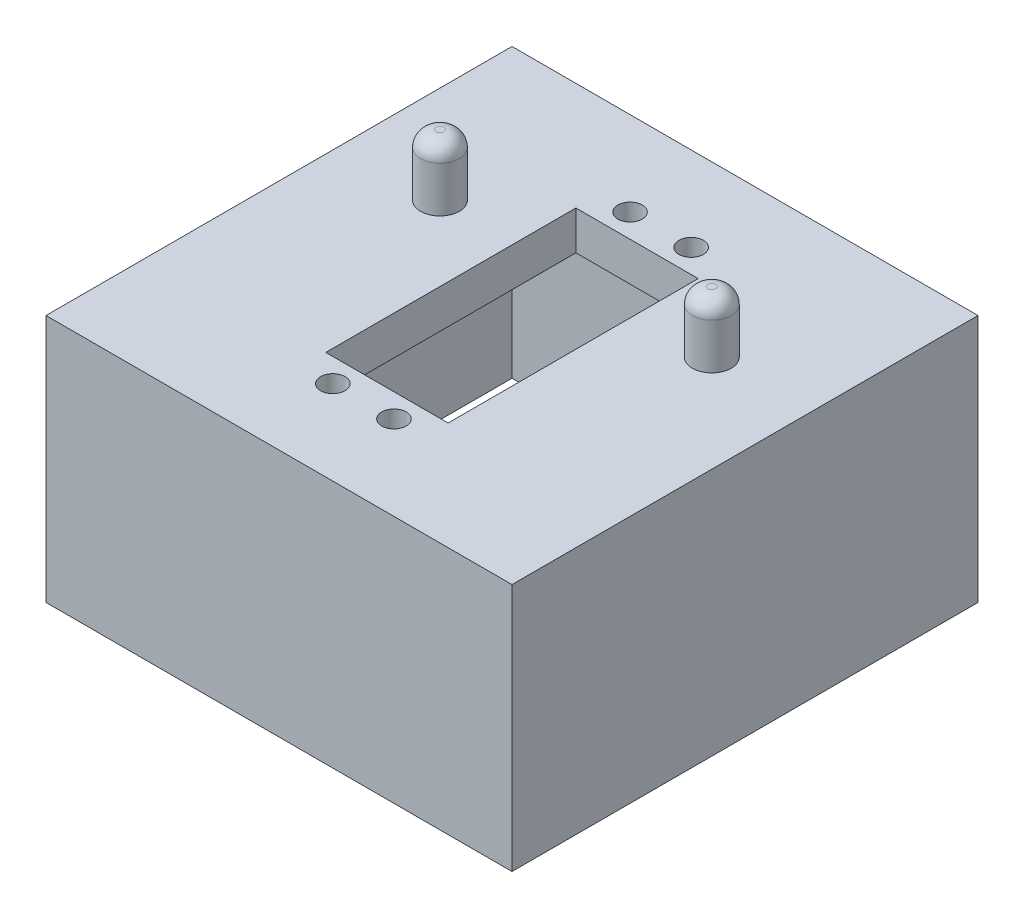
ISO-10303-21;
HEADER;
FILE_DESCRIPTION(('STEP AP214'),'2;1');
FILE_NAME('part.step','',(''),(''),'','','');
FILE_SCHEMA(('AUTOMOTIVE_DESIGN { 1 0 10303 214 1 1 1 1 }'));
ENDSEC;
DATA;
#1=APPLICATION_CONTEXT('core data for automotive mechanical design processes');
#2=APPLICATION_PROTOCOL_DEFINITION('international standard','automotive_design',2000,#1);
#3=PRODUCT_CONTEXT('',#1,'mechanical');
#4=PRODUCT('Part','Part','',(#3));
#5=PRODUCT_RELATED_PRODUCT_CATEGORY('part','',(#4));
#6=PRODUCT_DEFINITION_FORMATION('','',#4);
#7=PRODUCT_DEFINITION_CONTEXT('part definition',#1,'design');
#8=PRODUCT_DEFINITION('design','',#6,#7);
#9=PRODUCT_DEFINITION_SHAPE('','',#8);
#10=(LENGTH_UNIT() NAMED_UNIT(*) SI_UNIT(.MILLI.,.METRE.));
#11=(NAMED_UNIT(*) PLANE_ANGLE_UNIT() SI_UNIT($,.RADIAN.));
#12=(NAMED_UNIT(*) SI_UNIT($,.STERADIAN.) SOLID_ANGLE_UNIT());
#13=UNCERTAINTY_MEASURE_WITH_UNIT(LENGTH_MEASURE(1.E-05),#10,'distance_accuracy_value','');
#14=(GEOMETRIC_REPRESENTATION_CONTEXT(3) GLOBAL_UNCERTAINTY_ASSIGNED_CONTEXT((#13)) GLOBAL_UNIT_ASSIGNED_CONTEXT((#10,
#11,#12)) REPRESENTATION_CONTEXT('',''));
#15=CARTESIAN_POINT('',(0.,0.,0.));
#16=DIRECTION('',(0.,0.,1.));
#17=DIRECTION('',(1.,0.,0.));
#18=AXIS2_PLACEMENT_3D('',#15,#16,#17);
#19=CARTESIAN_POINT('',(0.,40.64,76.2));
#20=DIRECTION('',(0.,1.,0.));
#21=DIRECTION('',(0.,0.,1.));
#22=AXIS2_PLACEMENT_3D('',#19,#20,#21);
#23=PLANE('',#22);
#24=CARTESIAN_POINT('',(60.325,40.64,27.65044));
#25=DIRECTION('',(0.,1.,0.));
#26=DIRECTION('',(0.,0.,1.));
#27=AXIS2_PLACEMENT_3D('',#24,#25,#26);
#28=CIRCLE('',#27,3.17500000000001);
#29=CARTESIAN_POINT('',(60.325,40.64,30.82544));
#30=VERTEX_POINT('',#29);
#31=EDGE_CURVE('E587',#30,#30,#28,.T.);
#32=ORIENTED_EDGE('',*,*,#31,.F.);
#33=EDGE_LOOP('',(#32));
#34=FACE_BOUND('',#33,.T.);
#35=CARTESIAN_POINT('',(15.875,40.64,27.65044));
#36=DIRECTION('',(0.,1.,0.));
#37=DIRECTION('',(0.,0.,1.));
#38=AXIS2_PLACEMENT_3D('',#35,#36,#37);
#39=CIRCLE('',#38,3.175);
#40=CARTESIAN_POINT('',(15.875,40.64,30.82544));
#41=VERTEX_POINT('',#40);
#42=EDGE_CURVE('E590',#41,#41,#39,.T.);
#43=ORIENTED_EDGE('',*,*,#42,.F.);
#44=EDGE_LOOP('',(#43));
#45=FACE_BOUND('',#44,.T.);
#46=CARTESIAN_POINT('',(43.1,40.64,13.8));
#47=DIRECTION('',(0.,1.,0.));
#48=DIRECTION('',(0.,0.,1.));
#49=AXIS2_PLACEMENT_3D('',#46,#47,#48);
#50=CIRCLE('',#49,2.);
#51=CARTESIAN_POINT('',(43.1,40.64,15.8));
#52=VERTEX_POINT('',#51);
#53=EDGE_CURVE('E593',#52,#52,#50,.T.);
#54=ORIENTED_EDGE('',*,*,#53,.F.);
#55=EDGE_LOOP('',(#54));
#56=FACE_BOUND('',#55,.T.);
#57=CARTESIAN_POINT('',(33.1,40.64,13.8));
#58=DIRECTION('',(0.,1.,0.));
#59=DIRECTION('',(0.,0.,1.));
#60=AXIS2_PLACEMENT_3D('',#57,#58,#59);
#61=CIRCLE('',#60,2.00000000000002);
#62=CARTESIAN_POINT('',(33.1,40.64,15.8));
#63=VERTEX_POINT('',#62);
#64=EDGE_CURVE('E601',#63,#63,#61,.T.);
#65=ORIENTED_EDGE('',*,*,#64,.F.);
#66=EDGE_LOOP('',(#65));
#67=FACE_BOUND('',#66,.T.);
#68=CARTESIAN_POINT('',(33.1,40.64,62.4));
#69=DIRECTION('',(0.,1.,0.));
#70=DIRECTION('',(0.,0.,1.));
#71=AXIS2_PLACEMENT_3D('',#68,#69,#70);
#72=CIRCLE('',#71,2.00000000000001);
#73=CARTESIAN_POINT('',(33.1,40.64,64.4));
#74=VERTEX_POINT('',#73);
#75=EDGE_CURVE('E598',#74,#74,#72,.T.);
#76=ORIENTED_EDGE('',*,*,#75,.F.);
#77=EDGE_LOOP('',(#76));
#78=FACE_BOUND('',#77,.T.);
#79=CARTESIAN_POINT('',(43.1,40.64,62.4));
#80=DIRECTION('',(0.,1.,0.));
#81=DIRECTION('',(0.,0.,1.));
#82=AXIS2_PLACEMENT_3D('',#79,#80,#81);
#83=CIRCLE('',#82,2.);
#84=CARTESIAN_POINT('',(43.1,40.64,64.4));
#85=VERTEX_POINT('',#84);
#86=EDGE_CURVE('E594',#85,#85,#83,.T.);
#87=ORIENTED_EDGE('',*,*,#86,.F.);
#88=EDGE_LOOP('',(#87));
#89=FACE_BOUND('',#88,.T.);
#90=DIRECTION('',(1.,0.,0.));
#91=VECTOR('',#90,1.);
#92=CARTESIAN_POINT('',(0.,40.64,0.));
#93=LINE('',#92,#91);
#94=CARTESIAN_POINT('',(0.,40.64,0.));
#95=VERTEX_POINT('',#94);
#96=CARTESIAN_POINT('',(76.2,40.64,0.));
#97=VERTEX_POINT('',#96);
#98=EDGE_CURVE('E234',#95,#97,#93,.T.);
#99=ORIENTED_EDGE('',*,*,#98,.F.);
#100=DIRECTION('',(0.,0.,-1.));
#101=VECTOR('',#100,1.);
#102=CARTESIAN_POINT('',(0.,40.64,76.2));
#103=LINE('',#102,#101);
#104=CARTESIAN_POINT('',(0.,40.64,76.2));
#105=VERTEX_POINT('',#104);
#106=EDGE_CURVE('E240',#105,#95,#103,.T.);
#107=ORIENTED_EDGE('',*,*,#106,.F.);
#108=DIRECTION('',(1.,0.,0.));
#109=VECTOR('',#108,1.);
#110=CARTESIAN_POINT('',(0.,40.64,76.2));
#111=LINE('',#110,#109);
#112=CARTESIAN_POINT('',(76.2,40.64,76.2));
#113=VERTEX_POINT('',#112);
#114=EDGE_CURVE('E222',#105,#113,#111,.T.);
#115=ORIENTED_EDGE('',*,*,#114,.T.);
#116=DIRECTION('',(0.,0.,-1.));
#117=VECTOR('',#116,1.);
#118=CARTESIAN_POINT('',(76.2,40.64,76.2));
#119=LINE('',#118,#117);
#120=EDGE_CURVE('E242',#113,#97,#119,.T.);
#121=ORIENTED_EDGE('',*,*,#120,.T.);
#122=EDGE_LOOP('',(#99,#107,#115,#121));
#123=FACE_BOUND('',#122,.T.);
#124=DIRECTION('',(1.,0.,0.));
#125=VECTOR('',#124,1.);
#126=CARTESIAN_POINT('',(0.,40.64,58.55));
#127=LINE('',#126,#125);
#128=CARTESIAN_POINT('',(28.1,40.64,58.55));
#129=VERTEX_POINT('',#128);
#130=CARTESIAN_POINT('',(48.1,40.64,58.55));
#131=VERTEX_POINT('',#130);
#132=EDGE_CURVE('E597',#129,#131,#127,.T.);
#133=ORIENTED_EDGE('',*,*,#132,.F.);
#134=DIRECTION('',(0.,0.,-1.));
#135=VECTOR('',#134,1.);
#136=CARTESIAN_POINT('',(28.1,40.64,0.));
#137=LINE('',#136,#135);
#138=CARTESIAN_POINT('',(28.1,40.64,17.65));
#139=VERTEX_POINT('',#138);
#140=EDGE_CURVE('E88',#129,#139,#137,.T.);
#141=ORIENTED_EDGE('',*,*,#140,.T.);
#142=DIRECTION('',(1.,0.,0.));
#143=VECTOR('',#142,1.);
#144=CARTESIAN_POINT('',(0.,40.64,17.65));
#145=LINE('',#144,#143);
#146=CARTESIAN_POINT('',(48.1,40.64,17.65));
#147=VERTEX_POINT('',#146);
#148=EDGE_CURVE('E611',#139,#147,#145,.T.);
#149=ORIENTED_EDGE('',*,*,#148,.T.);
#150=DIRECTION('',(0.,0.,-1.));
#151=VECTOR('',#150,1.);
#152=CARTESIAN_POINT('',(48.1,40.64,0.));
#153=LINE('',#152,#151);
#154=EDGE_CURVE('E608',#131,#147,#153,.T.);
#155=ORIENTED_EDGE('',*,*,#154,.F.);
#156=EDGE_LOOP('',(#133,#141,#149,#155));
#157=FACE_BOUND('',#156,.T.);
#158=ADVANCED_FACE('F65',(#34,#45,#56,#67,#78,#89,#123,#157),#23,.T.);
#159=CARTESIAN_POINT('',(0.,34.29,76.2));
#160=DIRECTION('',(0.,1.,0.));
#161=DIRECTION('',(0.,0.,1.));
#162=AXIS2_PLACEMENT_3D('',#159,#160,#161);
#163=PLANE('',#162);
#164=CARTESIAN_POINT('',(43.1,34.29,13.8));
#165=DIRECTION('',(0.,1.,0.));
#166=DIRECTION('',(0.,0.,1.));
#167=AXIS2_PLACEMENT_3D('',#164,#165,#166);
#168=CIRCLE('',#167,2.);
#169=CARTESIAN_POINT('',(43.1,34.29,15.8));
#170=VERTEX_POINT('',#169);
#171=EDGE_CURVE('E211',#170,#170,#168,.T.);
#172=ORIENTED_EDGE('',*,*,#171,.T.);
#173=EDGE_LOOP('',(#172));
#174=FACE_BOUND('',#173,.T.);
#175=CARTESIAN_POINT('',(33.1,34.29,13.8));
#176=DIRECTION('',(0.,1.,0.));
#177=DIRECTION('',(0.,0.,1.));
#178=AXIS2_PLACEMENT_3D('',#175,#176,#177);
#179=CIRCLE('',#178,2.00000000000002);
#180=CARTESIAN_POINT('',(33.1,34.29,15.8));
#181=VERTEX_POINT('',#180);
#182=EDGE_CURVE('E265',#181,#181,#179,.T.);
#183=ORIENTED_EDGE('',*,*,#182,.T.);
#184=EDGE_LOOP('',(#183));
#185=FACE_BOUND('',#184,.T.);
#186=CARTESIAN_POINT('',(33.1,34.29,62.4));
#187=DIRECTION('',(0.,1.,0.));
#188=DIRECTION('',(0.,0.,1.));
#189=AXIS2_PLACEMENT_3D('',#186,#187,#188);
#190=CIRCLE('',#189,2.00000000000001);
#191=CARTESIAN_POINT('',(33.1,34.29,64.4));
#192=VERTEX_POINT('',#191);
#193=EDGE_CURVE('E261',#192,#192,#190,.T.);
#194=ORIENTED_EDGE('',*,*,#193,.T.);
#195=EDGE_LOOP('',(#194));
#196=FACE_BOUND('',#195,.T.);
#197=CARTESIAN_POINT('',(43.1,34.29,62.4));
#198=DIRECTION('',(0.,1.,0.));
#199=DIRECTION('',(0.,0.,1.));
#200=AXIS2_PLACEMENT_3D('',#197,#198,#199);
#201=CIRCLE('',#200,2.);
#202=CARTESIAN_POINT('',(43.1,34.29,64.4));
#203=VERTEX_POINT('',#202);
#204=EDGE_CURVE('E258',#203,#203,#201,.T.);
#205=ORIENTED_EDGE('',*,*,#204,.T.);
#206=EDGE_LOOP('',(#205));
#207=FACE_BOUND('',#206,.T.);
#208=DIRECTION('',(1.,0.,0.));
#209=VECTOR('',#208,1.);
#210=CARTESIAN_POINT('',(0.,34.29,6.34999999999999));
#211=LINE('',#210,#209);
#212=CARTESIAN_POINT('',(6.35,34.29,6.35));
#213=VERTEX_POINT('',#212);
#214=CARTESIAN_POINT('',(69.85,34.29,6.35));
#215=VERTEX_POINT('',#214);
#216=EDGE_CURVE('E209',#213,#215,#211,.T.);
#217=ORIENTED_EDGE('',*,*,#216,.T.);
#218=DIRECTION('',(0.,0.,-1.));
#219=VECTOR('',#218,1.);
#220=CARTESIAN_POINT('',(69.85,34.29,76.2));
#221=LINE('',#220,#219);
#222=CARTESIAN_POINT('',(69.85,34.29,69.85));
#223=VERTEX_POINT('',#222);
#224=EDGE_CURVE('E622',#223,#215,#221,.T.);
#225=ORIENTED_EDGE('',*,*,#224,.F.);
#226=DIRECTION('',(1.,0.,0.));
#227=VECTOR('',#226,1.);
#228=CARTESIAN_POINT('',(0.,34.29,69.85));
#229=LINE('',#228,#227);
#230=CARTESIAN_POINT('',(6.35,34.29,69.85));
#231=VERTEX_POINT('',#230);
#232=EDGE_CURVE('E628',#231,#223,#229,.T.);
#233=ORIENTED_EDGE('',*,*,#232,.F.);
#234=DIRECTION('',(0.,0.,-1.));
#235=VECTOR('',#234,1.);
#236=CARTESIAN_POINT('',(6.35,34.29,76.2));
#237=LINE('',#236,#235);
#238=EDGE_CURVE('E625',#231,#213,#237,.T.);
#239=ORIENTED_EDGE('',*,*,#238,.T.);
#240=EDGE_LOOP('',(#217,#225,#233,#239));
#241=FACE_BOUND('',#240,.T.);
#242=DIRECTION('',(0.,0.,-1.));
#243=VECTOR('',#242,1.);
#244=CARTESIAN_POINT('',(28.1,34.29,76.2));
#245=LINE('',#244,#243);
#246=CARTESIAN_POINT('',(28.1,34.29,58.55));
#247=VERTEX_POINT('',#246);
#248=CARTESIAN_POINT('',(28.1,34.29,17.65));
#249=VERTEX_POINT('',#248);
#250=EDGE_CURVE('E255',#247,#249,#245,.T.);
#251=ORIENTED_EDGE('',*,*,#250,.F.);
#252=DIRECTION('',(1.,0.,0.));
#253=VECTOR('',#252,1.);
#254=CARTESIAN_POINT('',(0.,34.29,58.55));
#255=LINE('',#254,#253);
#256=CARTESIAN_POINT('',(48.1,34.29,58.55));
#257=VERTEX_POINT('',#256);
#258=EDGE_CURVE('E247',#247,#257,#255,.T.);
#259=ORIENTED_EDGE('',*,*,#258,.T.);
#260=DIRECTION('',(0.,0.,-1.));
#261=VECTOR('',#260,1.);
#262=CARTESIAN_POINT('',(48.1,34.29,76.2));
#263=LINE('',#262,#261);
#264=CARTESIAN_POINT('',(48.1,34.29,17.65));
#265=VERTEX_POINT('',#264);
#266=EDGE_CURVE('E250',#257,#265,#263,.T.);
#267=ORIENTED_EDGE('',*,*,#266,.T.);
#268=DIRECTION('',(1.,0.,0.));
#269=VECTOR('',#268,1.);
#270=CARTESIAN_POINT('',(0.,34.29,17.65));
#271=LINE('',#270,#269);
#272=EDGE_CURVE('E253',#249,#265,#271,.T.);
#273=ORIENTED_EDGE('',*,*,#272,.F.);
#274=EDGE_LOOP('',(#251,#259,#267,#273));
#275=FACE_BOUND('',#274,.T.);
#276=ADVANCED_FACE('F292',(#174,#185,#196,#207,#241,#275),#163,.F.);
#277=CARTESIAN_POINT('',(0.,0.,76.2));
#278=DIRECTION('',(0.,1.,0.));
#279=DIRECTION('',(0.,0.,1.));
#280=AXIS2_PLACEMENT_3D('',#277,#278,#279);
#281=PLANE('',#280);
#282=DIRECTION('',(1.,0.,0.));
#283=VECTOR('',#282,1.);
#284=CARTESIAN_POINT('',(0.,0.,0.));
#285=LINE('',#284,#283);
#286=CARTESIAN_POINT('',(0.,0.,0.));
#287=VERTEX_POINT('',#286);
#288=CARTESIAN_POINT('',(31.75,0.,0.));
#289=VERTEX_POINT('',#288);
#290=EDGE_CURVE('E197',#287,#289,#285,.T.);
#291=ORIENTED_EDGE('',*,*,#290,.T.);
#292=DIRECTION('',(0.,0.,-1.));
#293=VECTOR('',#292,1.);
#294=CARTESIAN_POINT('',(31.75,0.,76.201));
#295=LINE('',#294,#293);
#296=CARTESIAN_POINT('',(31.75,0.,6.34999999999999));
#297=VERTEX_POINT('',#296);
#298=EDGE_CURVE('E183',#297,#289,#295,.T.);
#299=ORIENTED_EDGE('',*,*,#298,.F.);
#300=DIRECTION('',(1.,0.,0.));
#301=VECTOR('',#300,1.);
#302=CARTESIAN_POINT('',(0.,0.,6.34999999999999));
#303=LINE('',#302,#301);
#304=CARTESIAN_POINT('',(6.35,0.,6.35));
#305=VERTEX_POINT('',#304);
#306=EDGE_CURVE('E195',#305,#297,#303,.T.);
#307=ORIENTED_EDGE('',*,*,#306,.F.);
#308=DIRECTION('',(0.,0.,-1.));
#309=VECTOR('',#308,1.);
#310=CARTESIAN_POINT('',(6.35,0.,76.2));
#311=LINE('',#310,#309);
#312=CARTESIAN_POINT('',(6.35,0.,69.85));
#313=VERTEX_POINT('',#312);
#314=EDGE_CURVE('E214',#313,#305,#311,.T.);
#315=ORIENTED_EDGE('',*,*,#314,.F.);
#316=DIRECTION('',(1.,0.,0.));
#317=VECTOR('',#316,1.);
#318=CARTESIAN_POINT('',(0.,0.,69.85));
#319=LINE('',#318,#317);
#320=CARTESIAN_POINT('',(69.85,0.,69.85));
#321=VERTEX_POINT('',#320);
#322=EDGE_CURVE('E629',#313,#321,#319,.T.);
#323=ORIENTED_EDGE('',*,*,#322,.T.);
#324=DIRECTION('',(0.,0.,-1.));
#325=VECTOR('',#324,1.);
#326=CARTESIAN_POINT('',(69.85,0.,76.2));
#327=LINE('',#326,#325);
#328=CARTESIAN_POINT('',(69.85,0.,6.35));
#329=VERTEX_POINT('',#328);
#330=EDGE_CURVE('E624',#321,#329,#327,.T.);
#331=ORIENTED_EDGE('',*,*,#330,.T.);
#332=CARTESIAN_POINT('',(44.45,0.,6.34999999999999));
#333=VERTEX_POINT('',#332);
#334=EDGE_CURVE('E206',#333,#329,#303,.T.);
#335=ORIENTED_EDGE('',*,*,#334,.F.);
#336=DIRECTION('',(0.,0.,-1.));
#337=VECTOR('',#336,1.);
#338=CARTESIAN_POINT('',(44.45,0.,76.201));
#339=LINE('',#338,#337);
#340=CARTESIAN_POINT('',(44.45,0.,0.));
#341=VERTEX_POINT('',#340);
#342=EDGE_CURVE('E80',#333,#341,#339,.T.);
#343=ORIENTED_EDGE('',*,*,#342,.T.);
#344=CARTESIAN_POINT('',(76.2,0.,0.));
#345=VERTEX_POINT('',#344);
#346=EDGE_CURVE('E231',#341,#345,#285,.T.);
#347=ORIENTED_EDGE('',*,*,#346,.T.);
#348=DIRECTION('',(0.,0.,-1.));
#349=VECTOR('',#348,1.);
#350=CARTESIAN_POINT('',(76.2,0.,76.2));
#351=LINE('',#350,#349);
#352=CARTESIAN_POINT('',(76.2,0.,76.2));
#353=VERTEX_POINT('',#352);
#354=EDGE_CURVE('E244',#353,#345,#351,.T.);
#355=ORIENTED_EDGE('',*,*,#354,.F.);
#356=DIRECTION('',(1.,0.,0.));
#357=VECTOR('',#356,1.);
#358=CARTESIAN_POINT('',(0.,0.,76.2));
#359=LINE('',#358,#357);
#360=CARTESIAN_POINT('',(0.,0.,76.2));
#361=VERTEX_POINT('',#360);
#362=EDGE_CURVE('E216',#361,#353,#359,.T.);
#363=ORIENTED_EDGE('',*,*,#362,.F.);
#364=DIRECTION('',(0.,0.,-1.));
#365=VECTOR('',#364,1.);
#366=CARTESIAN_POINT('',(0.,0.,76.2));
#367=LINE('',#366,#365);
#368=EDGE_CURVE('E228',#361,#287,#367,.T.);
#369=ORIENTED_EDGE('',*,*,#368,.T.);
#370=EDGE_LOOP('',(#291,#299,#307,#315,#323,#331,#335,#343,#347,#355,#363,#369));
#371=FACE_BOUND('',#370,.T.);
#372=ADVANCED_FACE('F193',(#371),#281,.F.);
#373=CARTESIAN_POINT('',(76.2,0.,76.2));
#374=DIRECTION('',(-1.,0.,0.));
#375=DIRECTION('',(0.,0.,1.));
#376=AXIS2_PLACEMENT_3D('',#373,#374,#375);
#377=PLANE('',#376);
#378=DIRECTION('',(0.,1.,0.));
#379=VECTOR('',#378,1.);
#380=CARTESIAN_POINT('',(76.2,0.,0.));
#381=LINE('',#380,#379);
#382=EDGE_CURVE('E230',#345,#97,#381,.T.);
#383=ORIENTED_EDGE('',*,*,#382,.T.);
#384=ORIENTED_EDGE('',*,*,#120,.F.);
#385=DIRECTION('',(0.,1.,0.));
#386=VECTOR('',#385,1.);
#387=CARTESIAN_POINT('',(76.2,0.,76.2));
#388=LINE('',#387,#386);
#389=EDGE_CURVE('E219',#353,#113,#388,.T.);
#390=ORIENTED_EDGE('',*,*,#389,.F.);
#391=ORIENTED_EDGE('',*,*,#354,.T.);
#392=EDGE_LOOP('',(#383,#384,#390,#391));
#393=FACE_BOUND('',#392,.T.);
#394=ADVANCED_FACE('F308',(#393),#377,.F.);
#395=CARTESIAN_POINT('',(0.,0.,76.2));
#396=DIRECTION('',(-1.,0.,0.));
#397=DIRECTION('',(0.,0.,1.));
#398=AXIS2_PLACEMENT_3D('',#395,#396,#397);
#399=PLANE('',#398);
#400=DIRECTION('',(0.,1.,0.));
#401=VECTOR('',#400,1.);
#402=CARTESIAN_POINT('',(0.,0.,0.));
#403=LINE('',#402,#401);
#404=EDGE_CURVE('E220',#287,#95,#403,.T.);
#405=ORIENTED_EDGE('',*,*,#404,.F.);
#406=ORIENTED_EDGE('',*,*,#368,.F.);
#407=DIRECTION('',(0.,1.,0.));
#408=VECTOR('',#407,1.);
#409=CARTESIAN_POINT('',(0.,0.,76.2));
#410=LINE('',#409,#408);
#411=EDGE_CURVE('E225',#361,#105,#410,.T.);
#412=ORIENTED_EDGE('',*,*,#411,.T.);
#413=ORIENTED_EDGE('',*,*,#106,.T.);
#414=EDGE_LOOP('',(#405,#406,#412,#413));
#415=FACE_BOUND('',#414,.T.);
#416=ADVANCED_FACE('F306',(#415),#399,.T.);
#417=CARTESIAN_POINT('',(0.,0.,76.2));
#418=DIRECTION('',(0.,0.,1.));
#419=DIRECTION('',(1.,0.,0.));
#420=AXIS2_PLACEMENT_3D('',#417,#418,#419);
#421=PLANE('',#420);
#422=ORIENTED_EDGE('',*,*,#362,.T.);
#423=ORIENTED_EDGE('',*,*,#389,.T.);
#424=ORIENTED_EDGE('',*,*,#114,.F.);
#425=ORIENTED_EDGE('',*,*,#411,.F.);
#426=EDGE_LOOP('',(#422,#423,#424,#425));
#427=FACE_BOUND('',#426,.T.);
#428=ADVANCED_FACE('F324',(#427),#421,.T.);
#429=CARTESIAN_POINT('',(0.,0.,0.));
#430=DIRECTION('',(0.,0.,1.));
#431=DIRECTION('',(1.,0.,0.));
#432=AXIS2_PLACEMENT_3D('',#429,#430,#431);
#433=PLANE('',#432);
#434=DIRECTION('',(1.,0.,0.));
#435=VECTOR('',#434,1.);
#436=CARTESIAN_POINT('',(44.45,6.35,0.));
#437=LINE('',#436,#435);
#438=CARTESIAN_POINT('',(31.75,6.35,0.));
#439=VERTEX_POINT('',#438);
#440=CARTESIAN_POINT('',(44.45,6.35,0.));
#441=VERTEX_POINT('',#440);
#442=EDGE_CURVE('E198',#439,#441,#437,.T.);
#443=ORIENTED_EDGE('',*,*,#442,.F.);
#444=DIRECTION('',(0.,1.,0.));
#445=VECTOR('',#444,1.);
#446=CARTESIAN_POINT('',(31.75,0.,0.));
#447=LINE('',#446,#445);
#448=EDGE_CURVE('E571',#289,#439,#447,.T.);
#449=ORIENTED_EDGE('',*,*,#448,.F.);
#450=ORIENTED_EDGE('',*,*,#290,.F.);
#451=ORIENTED_EDGE('',*,*,#404,.T.);
#452=ORIENTED_EDGE('',*,*,#98,.T.);
#453=ORIENTED_EDGE('',*,*,#382,.F.);
#454=ORIENTED_EDGE('',*,*,#346,.F.);
#455=DIRECTION('',(0.,-1.,0.));
#456=VECTOR('',#455,1.);
#457=CARTESIAN_POINT('',(44.45,0.,0.));
#458=LINE('',#457,#456);
#459=EDGE_CURVE('E574',#441,#341,#458,.T.);
#460=ORIENTED_EDGE('',*,*,#459,.F.);
#461=EDGE_LOOP('',(#443,#449,#450,#451,#452,#453,#454,#460));
#462=FACE_BOUND('',#461,.T.);
#463=ADVANCED_FACE('F319',(#462),#433,.F.);
#464=CARTESIAN_POINT('',(69.85,0.,76.2));
#465=DIRECTION('',(-1.,0.,0.));
#466=DIRECTION('',(0.,0.,1.));
#467=AXIS2_PLACEMENT_3D('',#464,#465,#466);
#468=PLANE('',#467);
#469=DIRECTION('',(0.,1.,0.));
#470=VECTOR('',#469,1.);
#471=CARTESIAN_POINT('',(69.85,0.,6.34999999999999));
#472=LINE('',#471,#470);
#473=EDGE_CURVE('E205',#329,#215,#472,.T.);
#474=ORIENTED_EDGE('',*,*,#473,.F.);
#475=ORIENTED_EDGE('',*,*,#330,.F.);
#476=DIRECTION('',(0.,1.,0.));
#477=VECTOR('',#476,1.);
#478=CARTESIAN_POINT('',(69.85,0.,69.85));
#479=LINE('',#478,#477);
#480=EDGE_CURVE('E626',#321,#223,#479,.T.);
#481=ORIENTED_EDGE('',*,*,#480,.T.);
#482=ORIENTED_EDGE('',*,*,#224,.T.);
#483=EDGE_LOOP('',(#474,#475,#481,#482));
#484=FACE_BOUND('',#483,.T.);
#485=ADVANCED_FACE('F323',(#484),#468,.T.);
#486=CARTESIAN_POINT('',(6.35,0.,76.2));
#487=DIRECTION('',(-1.,0.,0.));
#488=DIRECTION('',(0.,0.,1.));
#489=AXIS2_PLACEMENT_3D('',#486,#487,#488);
#490=PLANE('',#489);
#491=DIRECTION('',(0.,1.,0.));
#492=VECTOR('',#491,1.);
#493=CARTESIAN_POINT('',(6.35,0.,6.34999999999999));
#494=LINE('',#493,#492);
#495=EDGE_CURVE('E204',#305,#213,#494,.T.);
#496=ORIENTED_EDGE('',*,*,#495,.T.);
#497=ORIENTED_EDGE('',*,*,#238,.F.);
#498=DIRECTION('',(0.,1.,0.));
#499=VECTOR('',#498,1.);
#500=CARTESIAN_POINT('',(6.35,0.,69.85));
#501=LINE('',#500,#499);
#502=EDGE_CURVE('E635',#313,#231,#501,.T.);
#503=ORIENTED_EDGE('',*,*,#502,.F.);
#504=ORIENTED_EDGE('',*,*,#314,.T.);
#505=EDGE_LOOP('',(#496,#497,#503,#504));
#506=FACE_BOUND('',#505,.T.);
#507=ADVANCED_FACE('F500',(#506),#490,.F.);
#508=CARTESIAN_POINT('',(0.,0.,69.85));
#509=DIRECTION('',(0.,0.,1.));
#510=DIRECTION('',(1.,0.,0.));
#511=AXIS2_PLACEMENT_3D('',#508,#509,#510);
#512=PLANE('',#511);
#513=ORIENTED_EDGE('',*,*,#322,.F.);
#514=ORIENTED_EDGE('',*,*,#502,.T.);
#515=ORIENTED_EDGE('',*,*,#232,.T.);
#516=ORIENTED_EDGE('',*,*,#480,.F.);
#517=EDGE_LOOP('',(#513,#514,#515,#516));
#518=FACE_BOUND('',#517,.T.);
#519=ADVANCED_FACE('F333',(#518),#512,.F.);
#520=CARTESIAN_POINT('',(0.,0.,6.35));
#521=DIRECTION('',(0.,0.,1.));
#522=DIRECTION('',(1.,0.,0.));
#523=AXIS2_PLACEMENT_3D('',#520,#521,#522);
#524=PLANE('',#523);
#525=DIRECTION('',(0.,1.,0.));
#526=VECTOR('',#525,1.);
#527=CARTESIAN_POINT('',(31.75,0.,6.34999999999999));
#528=LINE('',#527,#526);
#529=CARTESIAN_POINT('',(31.75,6.35,6.34999999999999));
#530=VERTEX_POINT('',#529);
#531=EDGE_CURVE('E179',#297,#530,#528,.T.);
#532=ORIENTED_EDGE('',*,*,#531,.T.);
#533=DIRECTION('',(1.,0.,0.));
#534=VECTOR('',#533,1.);
#535=CARTESIAN_POINT('',(44.45,6.35,6.34999999999999));
#536=LINE('',#535,#534);
#537=CARTESIAN_POINT('',(44.45,6.35,6.34999999999999));
#538=VERTEX_POINT('',#537);
#539=EDGE_CURVE('E582',#530,#538,#536,.T.);
#540=ORIENTED_EDGE('',*,*,#539,.T.);
#541=DIRECTION('',(0.,-1.,0.));
#542=VECTOR('',#541,1.);
#543=CARTESIAN_POINT('',(44.45,0.,6.34999999999999));
#544=LINE('',#543,#542);
#545=EDGE_CURVE('E579',#538,#333,#544,.T.);
#546=ORIENTED_EDGE('',*,*,#545,.T.);
#547=ORIENTED_EDGE('',*,*,#334,.T.);
#548=ORIENTED_EDGE('',*,*,#473,.T.);
#549=ORIENTED_EDGE('',*,*,#216,.F.);
#550=ORIENTED_EDGE('',*,*,#495,.F.);
#551=ORIENTED_EDGE('',*,*,#306,.T.);
#552=EDGE_LOOP('',(#532,#540,#546,#547,#548,#549,#550,#551));
#553=FACE_BOUND('',#552,.T.);
#554=ADVANCED_FACE('F201',(#553),#524,.T.);
#555=CARTESIAN_POINT('',(28.1,0.,0.));
#556=DIRECTION('',(1.,0.,0.));
#557=DIRECTION('',(0.,0.,-1.));
#558=AXIS2_PLACEMENT_3D('',#555,#556,#557);
#559=PLANE('',#558);
#560=ORIENTED_EDGE('',*,*,#250,.T.);
#561=DIRECTION('',(0.,1.,0.));
#562=VECTOR('',#561,1.);
#563=CARTESIAN_POINT('',(28.1,0.,17.65));
#564=LINE('',#563,#562);
#565=EDGE_CURVE('E617',#249,#139,#564,.T.);
#566=ORIENTED_EDGE('',*,*,#565,.T.);
#567=ORIENTED_EDGE('',*,*,#140,.F.);
#568=DIRECTION('',(0.,1.,0.));
#569=VECTOR('',#568,1.);
#570=CARTESIAN_POINT('',(28.1,0.,58.55));
#571=LINE('',#570,#569);
#572=EDGE_CURVE('E262',#247,#129,#571,.T.);
#573=ORIENTED_EDGE('',*,*,#572,.F.);
#574=EDGE_LOOP('',(#560,#566,#567,#573));
#575=FACE_BOUND('',#574,.T.);
#576=ADVANCED_FACE('F332',(#575),#559,.T.);
#577=CARTESIAN_POINT('',(0.,0.,17.65));
#578=DIRECTION('',(0.,0.,1.));
#579=DIRECTION('',(1.,0.,0.));
#580=AXIS2_PLACEMENT_3D('',#577,#578,#579);
#581=PLANE('',#580);
#582=ORIENTED_EDGE('',*,*,#272,.T.);
#583=DIRECTION('',(0.,1.,0.));
#584=VECTOR('',#583,1.);
#585=CARTESIAN_POINT('',(48.1,0.,17.65));
#586=LINE('',#585,#584);
#587=EDGE_CURVE('E619',#265,#147,#586,.T.);
#588=ORIENTED_EDGE('',*,*,#587,.T.);
#589=ORIENTED_EDGE('',*,*,#148,.F.);
#590=ORIENTED_EDGE('',*,*,#565,.F.);
#591=EDGE_LOOP('',(#582,#588,#589,#590));
#592=FACE_BOUND('',#591,.T.);
#593=ADVANCED_FACE('F457',(#592),#581,.T.);
#594=CARTESIAN_POINT('',(48.1,0.,0.));
#595=DIRECTION('',(1.,0.,0.));
#596=DIRECTION('',(0.,0.,-1.));
#597=AXIS2_PLACEMENT_3D('',#594,#595,#596);
#598=PLANE('',#597);
#599=DIRECTION('',(0.,1.,0.));
#600=VECTOR('',#599,1.);
#601=CARTESIAN_POINT('',(48.1,0.,58.55));
#602=LINE('',#601,#600);
#603=EDGE_CURVE('E615',#257,#131,#602,.T.);
#604=ORIENTED_EDGE('',*,*,#603,.T.);
#605=ORIENTED_EDGE('',*,*,#154,.T.);
#606=ORIENTED_EDGE('',*,*,#587,.F.);
#607=ORIENTED_EDGE('',*,*,#266,.F.);
#608=EDGE_LOOP('',(#604,#605,#606,#607));
#609=FACE_BOUND('',#608,.T.);
#610=ADVANCED_FACE('F447',(#609),#598,.F.);
#611=CARTESIAN_POINT('',(0.,0.,58.55));
#612=DIRECTION('',(0.,0.,1.));
#613=DIRECTION('',(1.,0.,0.));
#614=AXIS2_PLACEMENT_3D('',#611,#612,#613);
#615=PLANE('',#614);
#616=ORIENTED_EDGE('',*,*,#572,.T.);
#617=ORIENTED_EDGE('',*,*,#132,.T.);
#618=ORIENTED_EDGE('',*,*,#603,.F.);
#619=ORIENTED_EDGE('',*,*,#258,.F.);
#620=EDGE_LOOP('',(#616,#617,#618,#619));
#621=FACE_BOUND('',#620,.T.);
#622=ADVANCED_FACE('F437',(#621),#615,.F.);
#623=CARTESIAN_POINT('',(43.1,0.,62.4));
#624=DIRECTION('',(0.,1.,0.));
#625=DIRECTION('',(0.,0.,1.));
#626=AXIS2_PLACEMENT_3D('',#623,#624,#625);
#627=CYLINDRICAL_SURFACE('',#626,2.);
#628=ORIENTED_EDGE('',*,*,#86,.T.);
#629=EDGE_LOOP('',(#628));
#630=FACE_BOUND('',#629,.T.);
#631=ORIENTED_EDGE('',*,*,#204,.F.);
#632=EDGE_LOOP('',(#631));
#633=FACE_BOUND('',#632,.T.);
#634=ADVANCED_FACE('F428',(#630,#633),#627,.F.);
#635=CARTESIAN_POINT('',(33.1,0.,62.4));
#636=DIRECTION('',(0.,1.,0.));
#637=DIRECTION('',(0.,0.,1.));
#638=AXIS2_PLACEMENT_3D('',#635,#636,#637);
#639=CYLINDRICAL_SURFACE('',#638,2.00000000000001);
#640=ORIENTED_EDGE('',*,*,#75,.T.);
#641=EDGE_LOOP('',(#640));
#642=FACE_BOUND('',#641,.T.);
#643=ORIENTED_EDGE('',*,*,#193,.F.);
#644=EDGE_LOOP('',(#643));
#645=FACE_BOUND('',#644,.T.);
#646=ADVANCED_FACE('F419',(#642,#645),#639,.F.);
#647=CARTESIAN_POINT('',(33.1,0.,13.8));
#648=DIRECTION('',(0.,1.,0.));
#649=DIRECTION('',(0.,0.,1.));
#650=AXIS2_PLACEMENT_3D('',#647,#648,#649);
#651=CYLINDRICAL_SURFACE('',#650,2.00000000000002);
#652=ORIENTED_EDGE('',*,*,#64,.T.);
#653=EDGE_LOOP('',(#652));
#654=FACE_BOUND('',#653,.T.);
#655=ORIENTED_EDGE('',*,*,#182,.F.);
#656=EDGE_LOOP('',(#655));
#657=FACE_BOUND('',#656,.T.);
#658=ADVANCED_FACE('F410',(#654,#657),#651,.F.);
#659=CARTESIAN_POINT('',(43.1,0.,13.8));
#660=DIRECTION('',(0.,1.,0.));
#661=DIRECTION('',(0.,0.,1.));
#662=AXIS2_PLACEMENT_3D('',#659,#660,#661);
#663=CYLINDRICAL_SURFACE('',#662,2.);
#664=ORIENTED_EDGE('',*,*,#53,.T.);
#665=EDGE_LOOP('',(#664));
#666=FACE_BOUND('',#665,.T.);
#667=ORIENTED_EDGE('',*,*,#171,.F.);
#668=EDGE_LOOP('',(#667));
#669=FACE_BOUND('',#668,.T.);
#670=ADVANCED_FACE('F402',(#666,#669),#663,.F.);
#671=CARTESIAN_POINT('',(15.875,50.64,27.65044));
#672=DIRECTION('',(0.,-1.,0.));
#673=DIRECTION('',(0.,0.,-1.));
#674=AXIS2_PLACEMENT_3D('',#671,#672,#673);
#675=CYLINDRICAL_SURFACE('',#674,3.175);
#676=CARTESIAN_POINT('',(15.875,48.1,27.65044));
#677=DIRECTION('',(0.,1.,0.));
#678=DIRECTION('',(0.,0.,1.));
#679=AXIS2_PLACEMENT_3D('',#676,#677,#678);
#680=CIRCLE('',#679,3.175);
#681=CARTESIAN_POINT('',(15.875,48.1,30.82544));
#682=VERTEX_POINT('',#681);
#683=EDGE_CURVE('E272',#682,#682,#680,.F.);
#684=ORIENTED_EDGE('',*,*,#683,.T.);
#685=EDGE_LOOP('',(#684));
#686=FACE_BOUND('',#685,.T.);
#687=ORIENTED_EDGE('',*,*,#42,.T.);
#688=EDGE_LOOP('',(#687));
#689=FACE_BOUND('',#688,.T.);
#690=ADVANCED_FACE('F394',(#686,#689),#675,.T.);
#691=CARTESIAN_POINT('',(15.875,50.64,27.65044));
#692=DIRECTION('',(0.,1.,0.));
#693=DIRECTION('',(0.,0.,1.));
#694=AXIS2_PLACEMENT_3D('',#691,#692,#693);
#695=PLANE('',#694);
#696=CARTESIAN_POINT('',(15.875,50.64,27.65044));
#697=DIRECTION('',(0.,1.,0.));
#698=DIRECTION('',(0.,0.,1.));
#699=AXIS2_PLACEMENT_3D('',#696,#697,#698);
#700=CIRCLE('',#699,0.635000000000001);
#701=CARTESIAN_POINT('',(15.875,50.64,28.28544));
#702=VERTEX_POINT('',#701);
#703=EDGE_CURVE('E257',#702,#702,#700,.T.);
#704=ORIENTED_EDGE('',*,*,#703,.T.);
#705=EDGE_LOOP('',(#704));
#706=FACE_BOUND('',#705,.T.);
#707=ADVANCED_FACE('F385',(#706),#695,.T.);
#708=CARTESIAN_POINT('',(60.325,50.64,27.65044));
#709=DIRECTION('',(0.,-1.,0.));
#710=DIRECTION('',(0.,0.,-1.));
#711=AXIS2_PLACEMENT_3D('',#708,#709,#710);
#712=CYLINDRICAL_SURFACE('',#711,3.17500000000001);
#713=CARTESIAN_POINT('',(60.325,48.1,27.65044));
#714=DIRECTION('',(0.,1.,0.));
#715=DIRECTION('',(0.,0.,1.));
#716=AXIS2_PLACEMENT_3D('',#713,#714,#715);
#717=CIRCLE('',#716,3.17500000000001);
#718=CARTESIAN_POINT('',(60.325,48.1,30.82544));
#719=VERTEX_POINT('',#718);
#720=EDGE_CURVE('E12',#719,#719,#717,.F.);
#721=ORIENTED_EDGE('',*,*,#720,.T.);
#722=EDGE_LOOP('',(#721));
#723=FACE_BOUND('',#722,.T.);
#724=ORIENTED_EDGE('',*,*,#31,.T.);
#725=EDGE_LOOP('',(#724));
#726=FACE_BOUND('',#725,.T.);
#727=ADVANCED_FACE('F377',(#723,#726),#712,.T.);
#728=CARTESIAN_POINT('',(60.325,50.64,27.65044));
#729=DIRECTION('',(0.,1.,0.));
#730=DIRECTION('',(0.,0.,1.));
#731=AXIS2_PLACEMENT_3D('',#728,#729,#730);
#732=PLANE('',#731);
#733=CARTESIAN_POINT('',(60.325,50.64,27.65044));
#734=DIRECTION('',(0.,1.,0.));
#735=DIRECTION('',(0.,0.,1.));
#736=AXIS2_PLACEMENT_3D('',#733,#734,#735);
#737=CIRCLE('',#736,0.635000000000012);
#738=CARTESIAN_POINT('',(60.325,50.64,28.28544));
#739=VERTEX_POINT('',#738);
#740=EDGE_CURVE('E73',#739,#739,#737,.T.);
#741=ORIENTED_EDGE('',*,*,#740,.T.);
#742=EDGE_LOOP('',(#741));
#743=FACE_BOUND('',#742,.T.);
#744=ADVANCED_FACE('F277',(#743),#732,.T.);
#745=CARTESIAN_POINT('',(15.875,48.1,27.65044));
#746=DIRECTION('',(0.,1.,0.));
#747=DIRECTION('',(0.,0.,1.));
#748=AXIS2_PLACEMENT_3D('',#745,#746,#747);
#749=DEGENERATE_TOROIDAL_SURFACE('',#748,0.635000000000001,2.54,.T.);
#750=ORIENTED_EDGE('',*,*,#683,.F.);
#751=EDGE_LOOP('',(#750));
#752=FACE_BOUND('',#751,.T.);
#753=ORIENTED_EDGE('',*,*,#703,.F.);
#754=EDGE_LOOP('',(#753));
#755=FACE_BOUND('',#754,.T.);
#756=ADVANCED_FACE('F280',(#752,#755),#749,.T.);
#757=CARTESIAN_POINT('',(60.325,48.1,27.65044));
#758=DIRECTION('',(0.,1.,0.));
#759=DIRECTION('',(0.,0.,1.));
#760=AXIS2_PLACEMENT_3D('',#757,#758,#759);
#761=DEGENERATE_TOROIDAL_SURFACE('',#760,0.635000000000012,2.54,.T.);
#762=ORIENTED_EDGE('',*,*,#720,.F.);
#763=EDGE_LOOP('',(#762));
#764=FACE_BOUND('',#763,.T.);
#765=ORIENTED_EDGE('',*,*,#740,.F.);
#766=EDGE_LOOP('',(#765));
#767=FACE_BOUND('',#766,.T.);
#768=ADVANCED_FACE('F67',(#764,#767),#761,.T.);
#769=CARTESIAN_POINT('',(31.75,0.,76.201));
#770=DIRECTION('',(-1.,0.,0.));
#771=DIRECTION('',(0.,0.,1.));
#772=AXIS2_PLACEMENT_3D('',#769,#770,#771);
#773=PLANE('',#772);
#774=ORIENTED_EDGE('',*,*,#298,.T.);
#775=ORIENTED_EDGE('',*,*,#448,.T.);
#776=DIRECTION('',(0.,0.,-1.));
#777=VECTOR('',#776,1.);
#778=CARTESIAN_POINT('',(31.75,6.35,76.201));
#779=LINE('',#778,#777);
#780=EDGE_CURVE('E185',#530,#439,#779,.T.);
#781=ORIENTED_EDGE('',*,*,#780,.F.);
#782=ORIENTED_EDGE('',*,*,#531,.F.);
#783=EDGE_LOOP('',(#774,#775,#781,#782));
#784=FACE_BOUND('',#783,.T.);
#785=ADVANCED_FACE('F181',(#784),#773,.F.);
#786=CARTESIAN_POINT('',(44.45,6.35,76.201));
#787=DIRECTION('',(0.,1.,0.));
#788=DIRECTION('',(0.,0.,1.));
#789=AXIS2_PLACEMENT_3D('',#786,#787,#788);
#790=PLANE('',#789);
#791=ORIENTED_EDGE('',*,*,#780,.T.);
#792=ORIENTED_EDGE('',*,*,#442,.T.);
#793=DIRECTION('',(0.,0.,-1.));
#794=VECTOR('',#793,1.);
#795=CARTESIAN_POINT('',(44.45,6.35,76.201));
#796=LINE('',#795,#794);
#797=EDGE_CURVE('E581',#538,#441,#796,.T.);
#798=ORIENTED_EDGE('',*,*,#797,.F.);
#799=ORIENTED_EDGE('',*,*,#539,.F.);
#800=EDGE_LOOP('',(#791,#792,#798,#799));
#801=FACE_BOUND('',#800,.T.);
#802=ADVANCED_FACE('F287',(#801),#790,.F.);
#803=CARTESIAN_POINT('',(44.45,0.,76.201));
#804=DIRECTION('',(1.,0.,0.));
#805=DIRECTION('',(0.,0.,-1.));
#806=AXIS2_PLACEMENT_3D('',#803,#804,#805);
#807=PLANE('',#806);
#808=ORIENTED_EDGE('',*,*,#797,.T.);
#809=ORIENTED_EDGE('',*,*,#459,.T.);
#810=ORIENTED_EDGE('',*,*,#342,.F.);
#811=ORIENTED_EDGE('',*,*,#545,.F.);
#812=EDGE_LOOP('',(#808,#809,#810,#811));
#813=FACE_BOUND('',#812,.T.);
#814=ADVANCED_FACE('F348',(#813),#807,.F.);
#815=CLOSED_SHELL('',(#158,#276,#372,#394,#416,#428,#463,#485,#507,#519,#554,#576,#593,#610,
#622,#634,#646,#658,#670,#690,#707,#727,#744,#756,#768,#785,#802,#814));
#816=MANIFOLD_SOLID_BREP('B2',#815);
#817=ADVANCED_BREP_SHAPE_REPRESENTATION('',(#18,#816),#14);
#818=SHAPE_DEFINITION_REPRESENTATION(#9,#817);
ENDSEC;
END-ISO-10303-21;
